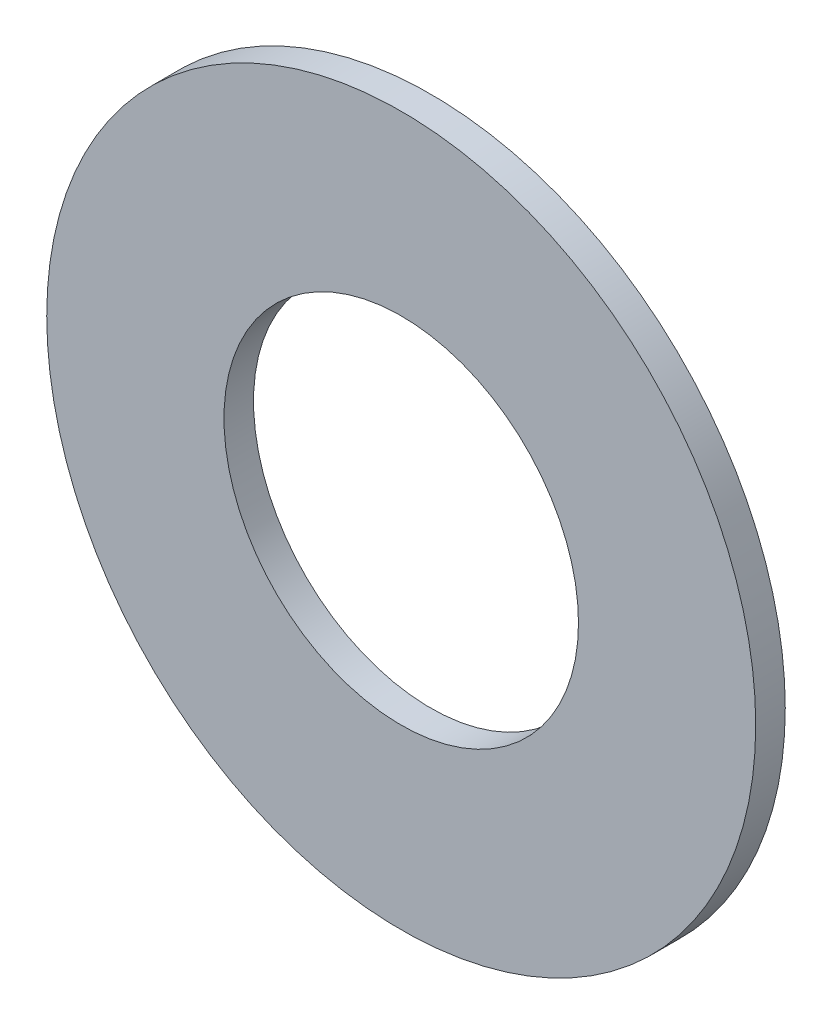
ISO-10303-21;
HEADER;
FILE_DESCRIPTION(('STEP AP214'),'2;1');
FILE_NAME('part.step','',(''),(''),'','','');
FILE_SCHEMA(('AUTOMOTIVE_DESIGN { 1 0 10303 214 1 1 1 1 }'));
ENDSEC;
DATA;
#1=APPLICATION_CONTEXT('core data for automotive mechanical design processes');
#2=APPLICATION_PROTOCOL_DEFINITION('international standard','automotive_design',2000,#1);
#3=PRODUCT_CONTEXT('',#1,'mechanical');
#4=PRODUCT('Part','Part','',(#3));
#5=PRODUCT_RELATED_PRODUCT_CATEGORY('part','',(#4));
#6=PRODUCT_DEFINITION_FORMATION('','',#4);
#7=PRODUCT_DEFINITION_CONTEXT('part definition',#1,'design');
#8=PRODUCT_DEFINITION('design','',#6,#7);
#9=PRODUCT_DEFINITION_SHAPE('','',#8);
#10=(LENGTH_UNIT() NAMED_UNIT(*) SI_UNIT(.MILLI.,.METRE.));
#11=(NAMED_UNIT(*) PLANE_ANGLE_UNIT() SI_UNIT($,.RADIAN.));
#12=(NAMED_UNIT(*) SI_UNIT($,.STERADIAN.) SOLID_ANGLE_UNIT());
#13=UNCERTAINTY_MEASURE_WITH_UNIT(LENGTH_MEASURE(1.E-05),#10,'distance_accuracy_value','');
#14=(GEOMETRIC_REPRESENTATION_CONTEXT(3) GLOBAL_UNCERTAINTY_ASSIGNED_CONTEXT((#13)) GLOBAL_UNIT_ASSIGNED_CONTEXT((#10,
#11,#12)) REPRESENTATION_CONTEXT('',''));
#15=CARTESIAN_POINT('',(0.,0.,0.));
#16=DIRECTION('',(0.,0.,1.));
#17=DIRECTION('',(1.,0.,0.));
#18=AXIS2_PLACEMENT_3D('',#15,#16,#17);
#19=CARTESIAN_POINT('',(0.,0.,0.5));
#20=DIRECTION('',(0.,0.,1.));
#21=DIRECTION('',(1.,0.,0.));
#22=AXIS2_PLACEMENT_3D('',#19,#20,#21);
#23=PLANE('',#22);
#24=CARTESIAN_POINT('',(0.,0.,0.5));
#25=DIRECTION('',(0.,0.,1.));
#26=DIRECTION('',(1.,0.,0.));
#27=AXIS2_PLACEMENT_3D('',#24,#25,#26);
#28=CIRCLE('',#27,6.);
#29=CARTESIAN_POINT('',(6.,0.,0.5));
#30=VERTEX_POINT('',#29);
#31=EDGE_CURVE('E10',#30,#30,#28,.T.);
#32=ORIENTED_EDGE('',*,*,#31,.T.);
#33=EDGE_LOOP('',(#32));
#34=FACE_BOUND('',#33,.T.);
#35=CARTESIAN_POINT('',(0.,0.,0.5));
#36=DIRECTION('',(0.,0.,1.));
#37=DIRECTION('',(1.,0.,0.));
#38=AXIS2_PLACEMENT_3D('',#35,#36,#37);
#39=CIRCLE('',#38,3.);
#40=CARTESIAN_POINT('',(3.,0.,0.5));
#41=VERTEX_POINT('',#40);
#42=EDGE_CURVE('E46',#41,#41,#39,.T.);
#43=ORIENTED_EDGE('',*,*,#42,.F.);
#44=EDGE_LOOP('',(#43));
#45=FACE_BOUND('',#44,.T.);
#46=ADVANCED_FACE('F35',(#34,#45),#23,.T.);
#47=CARTESIAN_POINT('',(0.,0.,0.));
#48=DIRECTION('',(0.,0.,1.));
#49=DIRECTION('',(1.,0.,0.));
#50=AXIS2_PLACEMENT_3D('',#47,#48,#49);
#51=PLANE('',#50);
#52=CARTESIAN_POINT('',(0.,0.,0.));
#53=DIRECTION('',(0.,0.,1.));
#54=DIRECTION('',(1.,0.,0.));
#55=AXIS2_PLACEMENT_3D('',#52,#53,#54);
#56=CIRCLE('',#55,6.);
#57=CARTESIAN_POINT('',(6.,0.,0.));
#58=VERTEX_POINT('',#57);
#59=EDGE_CURVE('E39',#58,#58,#56,.T.);
#60=ORIENTED_EDGE('',*,*,#59,.F.);
#61=EDGE_LOOP('',(#60));
#62=FACE_BOUND('',#61,.T.);
#63=CARTESIAN_POINT('',(0.,0.,0.));
#64=DIRECTION('',(0.,0.,1.));
#65=DIRECTION('',(1.,0.,0.));
#66=AXIS2_PLACEMENT_3D('',#63,#64,#65);
#67=CIRCLE('',#66,3.);
#68=CARTESIAN_POINT('',(3.,0.,0.));
#69=VERTEX_POINT('',#68);
#70=EDGE_CURVE('E48',#69,#69,#67,.T.);
#71=ORIENTED_EDGE('',*,*,#70,.T.);
#72=EDGE_LOOP('',(#71));
#73=FACE_BOUND('',#72,.T.);
#74=ADVANCED_FACE('F58',(#62,#73),#51,.F.);
#75=CARTESIAN_POINT('',(0.,0.,0.5));
#76=DIRECTION('',(0.,0.,-1.));
#77=DIRECTION('',(-1.,0.,0.));
#78=AXIS2_PLACEMENT_3D('',#75,#76,#77);
#79=CYLINDRICAL_SURFACE('',#78,6.);
#80=ORIENTED_EDGE('',*,*,#31,.F.);
#81=EDGE_LOOP('',(#80));
#82=FACE_BOUND('',#81,.T.);
#83=ORIENTED_EDGE('',*,*,#59,.T.);
#84=EDGE_LOOP('',(#83));
#85=FACE_BOUND('',#84,.T.);
#86=ADVANCED_FACE('F37',(#82,#85),#79,.T.);
#87=CARTESIAN_POINT('',(0.,0.,0.5));
#88=DIRECTION('',(0.,0.,-1.));
#89=DIRECTION('',(-1.,0.,0.));
#90=AXIS2_PLACEMENT_3D('',#87,#88,#89);
#91=CYLINDRICAL_SURFACE('',#90,3.);
#92=ORIENTED_EDGE('',*,*,#42,.T.);
#93=EDGE_LOOP('',(#92));
#94=FACE_BOUND('',#93,.T.);
#95=ORIENTED_EDGE('',*,*,#70,.F.);
#96=EDGE_LOOP('',(#95));
#97=FACE_BOUND('',#96,.T.);
#98=ADVANCED_FACE('F54',(#94,#97),#91,.F.);
#99=CLOSED_SHELL('',(#46,#74,#86,#98));
#100=MANIFOLD_SOLID_BREP('B2',#99);
#101=ADVANCED_BREP_SHAPE_REPRESENTATION('',(#18,#100),#14);
#102=SHAPE_DEFINITION_REPRESENTATION(#9,#101);
ENDSEC;
END-ISO-10303-21;
